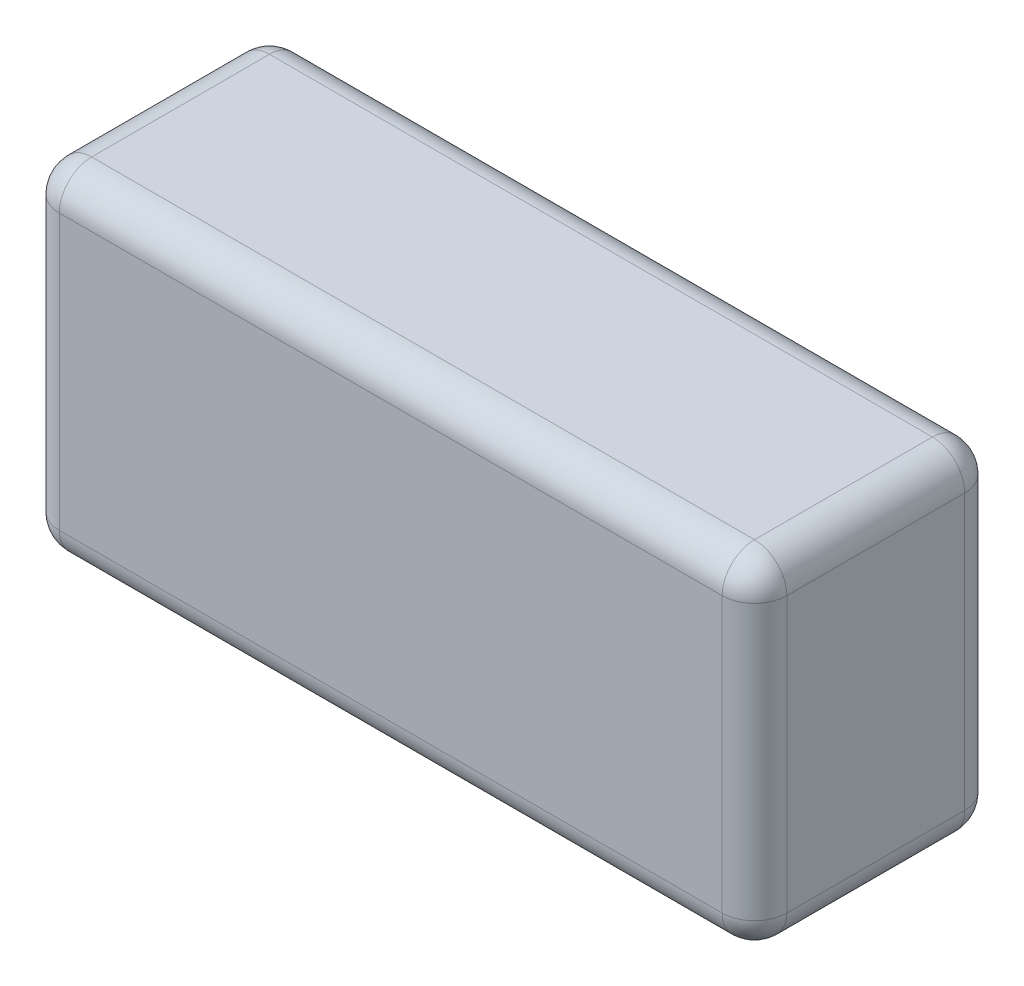
ISO-10303-21;
HEADER;
FILE_DESCRIPTION(('STEP AP214'),'2;1');
FILE_NAME('part.step','',(''),(''),'','','');
FILE_SCHEMA(('AUTOMOTIVE_DESIGN { 1 0 10303 214 1 1 1 1 }'));
ENDSEC;
DATA;
#1=APPLICATION_CONTEXT('core data for automotive mechanical design processes');
#2=APPLICATION_PROTOCOL_DEFINITION('international standard','automotive_design',2000,#1);
#3=PRODUCT_CONTEXT('',#1,'mechanical');
#4=PRODUCT('Part','Part','',(#3));
#5=PRODUCT_RELATED_PRODUCT_CATEGORY('part','',(#4));
#6=PRODUCT_DEFINITION_FORMATION('','',#4);
#7=PRODUCT_DEFINITION_CONTEXT('part definition',#1,'design');
#8=PRODUCT_DEFINITION('design','',#6,#7);
#9=PRODUCT_DEFINITION_SHAPE('','',#8);
#10=(LENGTH_UNIT() NAMED_UNIT(*) SI_UNIT(.MILLI.,.METRE.));
#11=(NAMED_UNIT(*) PLANE_ANGLE_UNIT() SI_UNIT($,.RADIAN.));
#12=(NAMED_UNIT(*) SI_UNIT($,.STERADIAN.) SOLID_ANGLE_UNIT());
#13=UNCERTAINTY_MEASURE_WITH_UNIT(LENGTH_MEASURE(1.E-05),#10,'distance_accuracy_value','');
#14=(GEOMETRIC_REPRESENTATION_CONTEXT(3) GLOBAL_UNCERTAINTY_ASSIGNED_CONTEXT((#13)) GLOBAL_UNIT_ASSIGNED_CONTEXT((#10,
#11,#12)) REPRESENTATION_CONTEXT('',''));
#15=CARTESIAN_POINT('',(0.,0.,0.));
#16=DIRECTION('',(0.,0.,1.));
#17=DIRECTION('',(1.,0.,0.));
#18=AXIS2_PLACEMENT_3D('',#15,#16,#17);
#19=CARTESIAN_POINT('',(37.5,35.,12.5));
#20=DIRECTION('',(-1.,0.,0.));
#21=DIRECTION('',(0.,0.,1.));
#22=AXIS2_PLACEMENT_3D('',#19,#20,#21);
#23=PLANE('',#22);
#24=DIRECTION('',(0.,-1.,0.));
#25=VECTOR('',#24,1.);
#26=CARTESIAN_POINT('',(37.5,35.,-9.16666666666667));
#27=LINE('',#26,#25);
#28=CARTESIAN_POINT('',(37.5,3.33333333333333,-9.16666666666667));
#29=VERTEX_POINT('',#28);
#30=CARTESIAN_POINT('',(37.5,31.6666666666667,-9.16666666666667));
#31=VERTEX_POINT('',#30);
#32=EDGE_CURVE('E140',#29,#31,#27,.F.);
#33=ORIENTED_EDGE('',*,*,#32,.T.);
#34=DIRECTION('',(0.,0.,-1.));
#35=VECTOR('',#34,1.);
#36=CARTESIAN_POINT('',(37.5,31.6666666666667,12.5));
#37=LINE('',#36,#35);
#38=CARTESIAN_POINT('',(37.5,31.6666666666667,9.16666666666667));
#39=VERTEX_POINT('',#38);
#40=EDGE_CURVE('E177',#31,#39,#37,.F.);
#41=ORIENTED_EDGE('',*,*,#40,.T.);
#42=DIRECTION('',(0.,-1.,0.));
#43=VECTOR('',#42,1.);
#44=CARTESIAN_POINT('',(37.5,35.,9.16666666666667));
#45=LINE('',#44,#43);
#46=CARTESIAN_POINT('',(37.5,3.33333333333333,9.16666666666667));
#47=VERTEX_POINT('',#46);
#48=EDGE_CURVE('E174',#39,#47,#45,.T.);
#49=ORIENTED_EDGE('',*,*,#48,.T.);
#50=DIRECTION('',(0.,0.,-1.));
#51=VECTOR('',#50,1.);
#52=CARTESIAN_POINT('',(37.5,3.33333333333333,-12.5));
#53=LINE('',#52,#51);
#54=EDGE_CURVE('E169',#47,#29,#53,.T.);
#55=ORIENTED_EDGE('',*,*,#54,.T.);
#56=EDGE_LOOP('',(#33,#41,#49,#55));
#57=FACE_BOUND('',#56,.T.);
#58=ADVANCED_FACE('F45',(#57),#23,.F.);
#59=CARTESIAN_POINT('',(-37.5,35.,-12.5));
#60=DIRECTION('',(0.,0.,1.));
#61=DIRECTION('',(1.,0.,0.));
#62=AXIS2_PLACEMENT_3D('',#59,#60,#61);
#63=PLANE('',#62);
#64=DIRECTION('',(0.,-1.,0.));
#65=VECTOR('',#64,1.);
#66=CARTESIAN_POINT('',(-34.1666666666667,35.,-12.5));
#67=LINE('',#66,#65);
#68=CARTESIAN_POINT('',(-34.1666666666667,3.33333333333333,-12.5));
#69=VERTEX_POINT('',#68);
#70=CARTESIAN_POINT('',(-34.1666666666667,31.6666666666667,-12.5));
#71=VERTEX_POINT('',#70);
#72=EDGE_CURVE('E162',#69,#71,#67,.F.);
#73=ORIENTED_EDGE('',*,*,#72,.T.);
#74=DIRECTION('',(-1.,0.,0.));
#75=VECTOR('',#74,1.);
#76=CARTESIAN_POINT('',(-37.5,31.6666666666667,-12.5));
#77=LINE('',#76,#75);
#78=CARTESIAN_POINT('',(34.1666666666667,31.6666666666667,-12.5));
#79=VERTEX_POINT('',#78);
#80=EDGE_CURVE('E166',#71,#79,#77,.F.);
#81=ORIENTED_EDGE('',*,*,#80,.T.);
#82=DIRECTION('',(0.,-1.,0.));
#83=VECTOR('',#82,1.);
#84=CARTESIAN_POINT('',(34.1666666666667,35.,-12.5));
#85=LINE('',#84,#83);
#86=CARTESIAN_POINT('',(34.1666666666667,3.33333333333333,-12.5));
#87=VERTEX_POINT('',#86);
#88=EDGE_CURVE('E138',#79,#87,#85,.T.);
#89=ORIENTED_EDGE('',*,*,#88,.T.);
#90=DIRECTION('',(-1.,0.,0.));
#91=VECTOR('',#90,1.);
#92=CARTESIAN_POINT('',(-37.5,3.33333333333333,-12.5));
#93=LINE('',#92,#91);
#94=EDGE_CURVE('E156',#87,#69,#93,.T.);
#95=ORIENTED_EDGE('',*,*,#94,.T.);
#96=EDGE_LOOP('',(#73,#81,#89,#95));
#97=FACE_BOUND('',#96,.T.);
#98=ADVANCED_FACE('F164',(#97),#63,.F.);
#99=CARTESIAN_POINT('',(-37.5,35.,12.5));
#100=DIRECTION('',(1.,0.,0.));
#101=DIRECTION('',(0.,0.,-1.));
#102=AXIS2_PLACEMENT_3D('',#99,#100,#101);
#103=PLANE('',#102);
#104=DIRECTION('',(0.,-1.,0.));
#105=VECTOR('',#104,1.);
#106=CARTESIAN_POINT('',(-37.5,35.,9.16666666666667));
#107=LINE('',#106,#105);
#108=CARTESIAN_POINT('',(-37.5,3.33333333333333,9.16666666666667));
#109=VERTEX_POINT('',#108);
#110=CARTESIAN_POINT('',(-37.5,31.6666666666667,9.16666666666667));
#111=VERTEX_POINT('',#110);
#112=EDGE_CURVE('E181',#109,#111,#107,.F.);
#113=ORIENTED_EDGE('',*,*,#112,.T.);
#114=DIRECTION('',(0.,0.,1.));
#115=VECTOR('',#114,1.);
#116=CARTESIAN_POINT('',(-37.5,31.6666666666667,12.5));
#117=LINE('',#116,#115);
#118=CARTESIAN_POINT('',(-37.5,31.6666666666667,-9.16666666666667));
#119=VERTEX_POINT('',#118);
#120=EDGE_CURVE('E186',#111,#119,#117,.F.);
#121=ORIENTED_EDGE('',*,*,#120,.T.);
#122=DIRECTION('',(0.,-1.,0.));
#123=VECTOR('',#122,1.);
#124=CARTESIAN_POINT('',(-37.5,35.,-9.16666666666667));
#125=LINE('',#124,#123);
#126=CARTESIAN_POINT('',(-37.5,3.33333333333333,-9.16666666666667));
#127=VERTEX_POINT('',#126);
#128=EDGE_CURVE('E183',#119,#127,#125,.T.);
#129=ORIENTED_EDGE('',*,*,#128,.T.);
#130=DIRECTION('',(0.,0.,1.));
#131=VECTOR('',#130,1.);
#132=CARTESIAN_POINT('',(-37.5,3.33333333333333,12.5));
#133=LINE('',#132,#131);
#134=EDGE_CURVE('E179',#127,#109,#133,.T.);
#135=ORIENTED_EDGE('',*,*,#134,.T.);
#136=EDGE_LOOP('',(#113,#121,#129,#135));
#137=FACE_BOUND('',#136,.T.);
#138=ADVANCED_FACE('F291',(#137),#103,.F.);
#139=CARTESIAN_POINT('',(-37.5,35.,12.5));
#140=DIRECTION('',(0.,0.,-1.));
#141=DIRECTION('',(-1.,0.,0.));
#142=AXIS2_PLACEMENT_3D('',#139,#140,#141);
#143=PLANE('',#142);
#144=DIRECTION('',(0.,-1.,0.));
#145=VECTOR('',#144,1.);
#146=CARTESIAN_POINT('',(34.1666666666667,35.,12.5));
#147=LINE('',#146,#145);
#148=CARTESIAN_POINT('',(34.1666666666667,3.33333333333333,12.5));
#149=VERTEX_POINT('',#148);
#150=CARTESIAN_POINT('',(34.1666666666667,31.6666666666667,12.5));
#151=VERTEX_POINT('',#150);
#152=EDGE_CURVE('E190',#149,#151,#147,.F.);
#153=ORIENTED_EDGE('',*,*,#152,.T.);
#154=DIRECTION('',(1.,0.,0.));
#155=VECTOR('',#154,1.);
#156=CARTESIAN_POINT('',(-37.5,31.6666666666667,12.5));
#157=LINE('',#156,#155);
#158=CARTESIAN_POINT('',(-34.1666666666667,31.6666666666667,12.5));
#159=VERTEX_POINT('',#158);
#160=EDGE_CURVE('E195',#151,#159,#157,.F.);
#161=ORIENTED_EDGE('',*,*,#160,.T.);
#162=DIRECTION('',(0.,-1.,0.));
#163=VECTOR('',#162,1.);
#164=CARTESIAN_POINT('',(-34.1666666666667,35.,12.5));
#165=LINE('',#164,#163);
#166=CARTESIAN_POINT('',(-34.1666666666667,3.33333333333333,12.5));
#167=VERTEX_POINT('',#166);
#168=EDGE_CURVE('E192',#159,#167,#165,.T.);
#169=ORIENTED_EDGE('',*,*,#168,.T.);
#170=DIRECTION('',(1.,0.,0.));
#171=VECTOR('',#170,1.);
#172=CARTESIAN_POINT('',(37.5,3.33333333333333,12.5));
#173=LINE('',#172,#171);
#174=EDGE_CURVE('E188',#167,#149,#173,.T.);
#175=ORIENTED_EDGE('',*,*,#174,.T.);
#176=EDGE_LOOP('',(#153,#161,#169,#175));
#177=FACE_BOUND('',#176,.T.);
#178=ADVANCED_FACE('F301',(#177),#143,.F.);
#179=CARTESIAN_POINT('',(0.,35.,0.));
#180=DIRECTION('',(0.,-1.,0.));
#181=DIRECTION('',(0.,0.,-1.));
#182=AXIS2_PLACEMENT_3D('',#179,#180,#181);
#183=PLANE('',#182);
#184=DIRECTION('',(0.,0.,1.));
#185=VECTOR('',#184,1.);
#186=CARTESIAN_POINT('',(-34.1666666666667,35.,0.));
#187=LINE('',#186,#185);
#188=CARTESIAN_POINT('',(-34.1666666666667,35.,-9.16666666666667));
#189=VERTEX_POINT('',#188);
#190=CARTESIAN_POINT('',(-34.1666666666667,35.,9.16666666666667));
#191=VERTEX_POINT('',#190);
#192=EDGE_CURVE('E201',#189,#191,#187,.T.);
#193=ORIENTED_EDGE('',*,*,#192,.T.);
#194=DIRECTION('',(1.,0.,0.));
#195=VECTOR('',#194,1.);
#196=CARTESIAN_POINT('',(0.,35.,9.16666666666667));
#197=LINE('',#196,#195);
#198=CARTESIAN_POINT('',(34.1666666666667,35.,9.16666666666667));
#199=VERTEX_POINT('',#198);
#200=EDGE_CURVE('E203',#191,#199,#197,.T.);
#201=ORIENTED_EDGE('',*,*,#200,.T.);
#202=DIRECTION('',(0.,0.,-1.));
#203=VECTOR('',#202,1.);
#204=CARTESIAN_POINT('',(34.1666666666667,35.,0.));
#205=LINE('',#204,#203);
#206=CARTESIAN_POINT('',(34.1666666666667,35.,-9.16666666666667));
#207=VERTEX_POINT('',#206);
#208=EDGE_CURVE('E197',#199,#207,#205,.T.);
#209=ORIENTED_EDGE('',*,*,#208,.T.);
#210=DIRECTION('',(-1.,0.,0.));
#211=VECTOR('',#210,1.);
#212=CARTESIAN_POINT('',(0.,35.,-9.16666666666667));
#213=LINE('',#212,#211);
#214=EDGE_CURVE('E199',#207,#189,#213,.T.);
#215=ORIENTED_EDGE('',*,*,#214,.T.);
#216=EDGE_LOOP('',(#193,#201,#209,#215));
#217=FACE_BOUND('',#216,.T.);
#218=ADVANCED_FACE('F283',(#217),#183,.F.);
#219=CARTESIAN_POINT('',(0.,0.,0.));
#220=DIRECTION('',(0.,-1.,0.));
#221=DIRECTION('',(0.,0.,-1.));
#222=AXIS2_PLACEMENT_3D('',#219,#220,#221);
#223=PLANE('',#222);
#224=DIRECTION('',(0.,0.,-1.));
#225=VECTOR('',#224,1.);
#226=CARTESIAN_POINT('',(34.1666666666667,0.,12.5));
#227=LINE('',#226,#225);
#228=CARTESIAN_POINT('',(34.1666666666667,0.,-9.16666666666667));
#229=VERTEX_POINT('',#228);
#230=CARTESIAN_POINT('',(34.1666666666667,0.,9.16666666666667));
#231=VERTEX_POINT('',#230);
#232=EDGE_CURVE('E206',#229,#231,#227,.F.);
#233=ORIENTED_EDGE('',*,*,#232,.T.);
#234=DIRECTION('',(1.,0.,0.));
#235=VECTOR('',#234,1.);
#236=CARTESIAN_POINT('',(-37.5,0.,9.16666666666667));
#237=LINE('',#236,#235);
#238=CARTESIAN_POINT('',(-34.1666666666667,0.,9.16666666666667));
#239=VERTEX_POINT('',#238);
#240=EDGE_CURVE('E11',#231,#239,#237,.F.);
#241=ORIENTED_EDGE('',*,*,#240,.T.);
#242=DIRECTION('',(0.,0.,1.));
#243=VECTOR('',#242,1.);
#244=CARTESIAN_POINT('',(-34.1666666666667,0.,-12.5));
#245=LINE('',#244,#243);
#246=CARTESIAN_POINT('',(-34.1666666666667,0.,-9.16666666666667));
#247=VERTEX_POINT('',#246);
#248=EDGE_CURVE('E54',#239,#247,#245,.F.);
#249=ORIENTED_EDGE('',*,*,#248,.T.);
#250=DIRECTION('',(-1.,0.,0.));
#251=VECTOR('',#250,1.);
#252=CARTESIAN_POINT('',(37.5,0.,-9.16666666666667));
#253=LINE('',#252,#251);
#254=EDGE_CURVE('E208',#247,#229,#253,.F.);
#255=ORIENTED_EDGE('',*,*,#254,.T.);
#256=EDGE_LOOP('',(#233,#241,#249,#255));
#257=FACE_BOUND('',#256,.T.);
#258=ADVANCED_FACE('F489',(#257),#223,.T.);
#259=CARTESIAN_POINT('',(-34.1666666666667,35.,9.16666666666667));
#260=DIRECTION('',(0.,-1.,0.));
#261=DIRECTION('',(0.,0.,-1.));
#262=AXIS2_PLACEMENT_3D('',#259,#260,#261);
#263=CYLINDRICAL_SURFACE('',#262,3.33333333333333);
#264=CARTESIAN_POINT('',(-34.1666666666667,31.6666666666667,9.16666666666667));
#265=DIRECTION('',(0.,1.,0.));
#266=DIRECTION('',(0.,0.,1.));
#267=AXIS2_PLACEMENT_3D('',#264,#265,#266);
#268=CIRCLE('',#267,3.33333333333333);
#269=EDGE_CURVE('E49',#111,#159,#268,.T.);
#270=ORIENTED_EDGE('',*,*,#269,.F.);
#271=ORIENTED_EDGE('',*,*,#112,.F.);
#272=CARTESIAN_POINT('',(-34.1666666666667,3.33333333333333,9.16666666666667));
#273=DIRECTION('',(0.,-1.,0.));
#274=DIRECTION('',(0.,0.,-1.));
#275=AXIS2_PLACEMENT_3D('',#272,#273,#274);
#276=CIRCLE('',#275,3.33333333333333);
#277=EDGE_CURVE('E261',#167,#109,#276,.T.);
#278=ORIENTED_EDGE('',*,*,#277,.F.);
#279=ORIENTED_EDGE('',*,*,#168,.F.);
#280=EDGE_LOOP('',(#270,#271,#278,#279));
#281=FACE_BOUND('',#280,.T.);
#282=ADVANCED_FACE('F47',(#281),#263,.T.);
#283=CARTESIAN_POINT('',(-34.1666666666667,31.6666666666667,9.16666666666667));
#284=DIRECTION('',(0.,0.,1.));
#285=DIRECTION('',(1.,0.,0.));
#286=AXIS2_PLACEMENT_3D('',#283,#284,#285);
#287=SPHERICAL_SURFACE('',#286,3.33333333333333);
#288=CARTESIAN_POINT('',(-34.1666666666667,31.6666666666667,9.16666666666667));
#289=DIRECTION('',(0.,0.,1.));
#290=DIRECTION('',(1.,0.,0.));
#291=AXIS2_PLACEMENT_3D('',#288,#289,#290);
#292=CIRCLE('',#291,3.33333333333333);
#293=EDGE_CURVE('E256',#111,#191,#292,.F.);
#294=ORIENTED_EDGE('',*,*,#293,.F.);
#295=ORIENTED_EDGE('',*,*,#269,.T.);
#296=CARTESIAN_POINT('',(-34.1666666666667,31.6666666666667,9.16666666666667));
#297=DIRECTION('',(-1.,0.,0.));
#298=DIRECTION('',(0.,0.,1.));
#299=AXIS2_PLACEMENT_3D('',#296,#297,#298);
#300=CIRCLE('',#299,3.33333333333333);
#301=EDGE_CURVE('E259',#191,#159,#300,.F.);
#302=ORIENTED_EDGE('',*,*,#301,.F.);
#303=EDGE_LOOP('',(#294,#295,#302));
#304=FACE_BOUND('',#303,.T.);
#305=ADVANCED_FACE('F271',(#304),#287,.T.);
#306=CARTESIAN_POINT('',(-34.1666666666667,3.33333333333333,9.16666666666667));
#307=DIRECTION('',(-1.,0.,0.));
#308=DIRECTION('',(0.,-1.,0.));
#309=AXIS2_PLACEMENT_3D('',#306,#307,#308);
#310=SPHERICAL_SURFACE('',#309,3.33333333333333);
#311=CARTESIAN_POINT('',(-34.1666666666667,3.33333333333333,9.16666666666667));
#312=DIRECTION('',(-1.,0.,0.));
#313=DIRECTION('',(0.,0.,1.));
#314=AXIS2_PLACEMENT_3D('',#311,#312,#313);
#315=CIRCLE('',#314,3.33333333333333);
#316=EDGE_CURVE('E251',#167,#239,#315,.F.);
#317=ORIENTED_EDGE('',*,*,#316,.F.);
#318=ORIENTED_EDGE('',*,*,#277,.T.);
#319=CARTESIAN_POINT('',(-34.1666666666667,3.33333333333333,9.16666666666667));
#320=DIRECTION('',(0.,0.,1.));
#321=DIRECTION('',(1.,0.,0.));
#322=AXIS2_PLACEMENT_3D('',#319,#320,#321);
#323=CIRCLE('',#322,3.33333333333333);
#324=EDGE_CURVE('E254',#239,#109,#323,.F.);
#325=ORIENTED_EDGE('',*,*,#324,.F.);
#326=EDGE_LOOP('',(#317,#318,#325));
#327=FACE_BOUND('',#326,.T.);
#328=ADVANCED_FACE('F468',(#327),#310,.T.);
#329=CARTESIAN_POINT('',(0.,31.6666666666667,9.16666666666667));
#330=DIRECTION('',(1.,0.,0.));
#331=DIRECTION('',(0.,0.,-1.));
#332=AXIS2_PLACEMENT_3D('',#329,#330,#331);
#333=CYLINDRICAL_SURFACE('',#332,3.33333333333333);
#334=ORIENTED_EDGE('',*,*,#301,.T.);
#335=ORIENTED_EDGE('',*,*,#160,.F.);
#336=CARTESIAN_POINT('',(34.1666666666667,31.6666666666667,9.16666666666667));
#337=DIRECTION('',(1.,0.,0.));
#338=DIRECTION('',(0.,0.,-1.));
#339=AXIS2_PLACEMENT_3D('',#336,#337,#338);
#340=CIRCLE('',#339,3.33333333333333);
#341=EDGE_CURVE('E245',#199,#151,#340,.T.);
#342=ORIENTED_EDGE('',*,*,#341,.F.);
#343=ORIENTED_EDGE('',*,*,#200,.F.);
#344=EDGE_LOOP('',(#334,#335,#342,#343));
#345=FACE_BOUND('',#344,.T.);
#346=ADVANCED_FACE('F279',(#345),#333,.T.);
#347=CARTESIAN_POINT('',(-34.1666666666667,31.6666666666667,0.));
#348=DIRECTION('',(0.,0.,1.));
#349=DIRECTION('',(1.,0.,0.));
#350=AXIS2_PLACEMENT_3D('',#347,#348,#349);
#351=CYLINDRICAL_SURFACE('',#350,3.33333333333333);
#352=ORIENTED_EDGE('',*,*,#293,.T.);
#353=ORIENTED_EDGE('',*,*,#192,.F.);
#354=CARTESIAN_POINT('',(-34.1666666666667,31.6666666666667,-9.16666666666667));
#355=DIRECTION('',(0.,0.,-1.));
#356=DIRECTION('',(-1.,0.,0.));
#357=AXIS2_PLACEMENT_3D('',#354,#355,#356);
#358=CIRCLE('',#357,3.33333333333333);
#359=EDGE_CURVE('E242',#119,#189,#358,.T.);
#360=ORIENTED_EDGE('',*,*,#359,.F.);
#361=ORIENTED_EDGE('',*,*,#120,.F.);
#362=EDGE_LOOP('',(#352,#353,#360,#361));
#363=FACE_BOUND('',#362,.T.);
#364=ADVANCED_FACE('F288',(#363),#351,.T.);
#365=CARTESIAN_POINT('',(-34.1666666666667,35.,-9.16666666666667));
#366=DIRECTION('',(0.,-1.,0.));
#367=DIRECTION('',(0.,0.,-1.));
#368=AXIS2_PLACEMENT_3D('',#365,#366,#367);
#369=CYLINDRICAL_SURFACE('',#368,3.33333333333333);
#370=CARTESIAN_POINT('',(-34.1666666666667,3.33333333333333,-9.16666666666667));
#371=DIRECTION('',(0.,-1.,0.));
#372=DIRECTION('',(0.,0.,-1.));
#373=AXIS2_PLACEMENT_3D('',#370,#371,#372);
#374=CIRCLE('',#373,3.33333333333333);
#375=EDGE_CURVE('E236',#127,#69,#374,.T.);
#376=ORIENTED_EDGE('',*,*,#375,.F.);
#377=ORIENTED_EDGE('',*,*,#128,.F.);
#378=CARTESIAN_POINT('',(-34.1666666666667,31.6666666666667,-9.16666666666667));
#379=DIRECTION('',(0.,1.,0.));
#380=DIRECTION('',(0.,0.,1.));
#381=AXIS2_PLACEMENT_3D('',#378,#379,#380);
#382=CIRCLE('',#381,3.33333333333333);
#383=EDGE_CURVE('E239',#71,#119,#382,.T.);
#384=ORIENTED_EDGE('',*,*,#383,.F.);
#385=ORIENTED_EDGE('',*,*,#72,.F.);
#386=EDGE_LOOP('',(#376,#377,#384,#385));
#387=FACE_BOUND('',#386,.T.);
#388=ADVANCED_FACE('F295',(#387),#369,.T.);
#389=CARTESIAN_POINT('',(-34.1666666666667,3.33333333333333,12.5));
#390=DIRECTION('',(0.,0.,-1.));
#391=DIRECTION('',(-1.,0.,0.));
#392=AXIS2_PLACEMENT_3D('',#389,#390,#391);
#393=CYLINDRICAL_SURFACE('',#392,3.33333333333333);
#394=ORIENTED_EDGE('',*,*,#324,.T.);
#395=ORIENTED_EDGE('',*,*,#134,.F.);
#396=CARTESIAN_POINT('',(-34.1666666666667,3.33333333333333,-9.16666666666667));
#397=DIRECTION('',(0.,0.,-1.));
#398=DIRECTION('',(-1.,0.,0.));
#399=AXIS2_PLACEMENT_3D('',#396,#397,#398);
#400=CIRCLE('',#399,3.33333333333333);
#401=EDGE_CURVE('E234',#247,#127,#400,.T.);
#402=ORIENTED_EDGE('',*,*,#401,.F.);
#403=ORIENTED_EDGE('',*,*,#248,.F.);
#404=EDGE_LOOP('',(#394,#395,#402,#403));
#405=FACE_BOUND('',#404,.T.);
#406=ADVANCED_FACE('F299',(#405),#393,.T.);
#407=CARTESIAN_POINT('',(-37.5,3.33333333333333,9.16666666666667));
#408=DIRECTION('',(-1.,0.,0.));
#409=DIRECTION('',(0.,0.,1.));
#410=AXIS2_PLACEMENT_3D('',#407,#408,#409);
#411=CYLINDRICAL_SURFACE('',#410,3.33333333333333);
#412=ORIENTED_EDGE('',*,*,#316,.T.);
#413=ORIENTED_EDGE('',*,*,#240,.F.);
#414=CARTESIAN_POINT('',(34.1666666666667,3.33333333333333,9.16666666666667));
#415=DIRECTION('',(1.,0.,0.));
#416=DIRECTION('',(0.,0.,-1.));
#417=AXIS2_PLACEMENT_3D('',#414,#415,#416);
#418=CIRCLE('',#417,3.33333333333333);
#419=EDGE_CURVE('E231',#149,#231,#418,.T.);
#420=ORIENTED_EDGE('',*,*,#419,.F.);
#421=ORIENTED_EDGE('',*,*,#174,.F.);
#422=EDGE_LOOP('',(#412,#413,#420,#421));
#423=FACE_BOUND('',#422,.T.);
#424=ADVANCED_FACE('F311',(#423),#411,.T.);
#425=CARTESIAN_POINT('',(34.1666666666667,35.,9.16666666666667));
#426=DIRECTION('',(0.,-1.,0.));
#427=DIRECTION('',(0.,0.,-1.));
#428=AXIS2_PLACEMENT_3D('',#425,#426,#427);
#429=CYLINDRICAL_SURFACE('',#428,3.33333333333333);
#430=CARTESIAN_POINT('',(34.1666666666667,31.6666666666667,9.16666666666667));
#431=DIRECTION('',(0.,1.,0.));
#432=DIRECTION('',(0.,0.,1.));
#433=AXIS2_PLACEMENT_3D('',#430,#431,#432);
#434=CIRCLE('',#433,3.33333333333333);
#435=EDGE_CURVE('E248',#151,#39,#434,.T.);
#436=ORIENTED_EDGE('',*,*,#435,.F.);
#437=ORIENTED_EDGE('',*,*,#152,.F.);
#438=CARTESIAN_POINT('',(34.1666666666667,3.33333333333333,9.16666666666667));
#439=DIRECTION('',(0.,-1.,0.));
#440=DIRECTION('',(0.,0.,-1.));
#441=AXIS2_PLACEMENT_3D('',#438,#439,#440);
#442=CIRCLE('',#441,3.33333333333333);
#443=EDGE_CURVE('E228',#47,#149,#442,.T.);
#444=ORIENTED_EDGE('',*,*,#443,.F.);
#445=ORIENTED_EDGE('',*,*,#48,.F.);
#446=EDGE_LOOP('',(#436,#437,#444,#445));
#447=FACE_BOUND('',#446,.T.);
#448=ADVANCED_FACE('F306',(#447),#429,.T.);
#449=CARTESIAN_POINT('',(34.1666666666667,31.6666666666667,9.16666666666667));
#450=DIRECTION('',(0.,0.,1.));
#451=DIRECTION('',(1.,0.,0.));
#452=AXIS2_PLACEMENT_3D('',#449,#450,#451);
#453=SPHERICAL_SURFACE('',#452,3.33333333333333);
#454=ORIENTED_EDGE('',*,*,#341,.T.);
#455=ORIENTED_EDGE('',*,*,#435,.T.);
#456=CARTESIAN_POINT('',(34.1666666666667,31.6666666666667,9.16666666666667));
#457=DIRECTION('',(0.,0.,1.));
#458=DIRECTION('',(1.,0.,0.));
#459=AXIS2_PLACEMENT_3D('',#456,#457,#458);
#460=CIRCLE('',#459,3.33333333333333);
#461=EDGE_CURVE('E225',#199,#39,#460,.F.);
#462=ORIENTED_EDGE('',*,*,#461,.F.);
#463=EDGE_LOOP('',(#454,#455,#462));
#464=FACE_BOUND('',#463,.T.);
#465=ADVANCED_FACE('F322',(#464),#453,.T.);
#466=CARTESIAN_POINT('',(-34.1666666666667,31.6666666666667,-9.16666666666667));
#467=DIRECTION('',(-1.,0.,0.));
#468=DIRECTION('',(0.,0.,1.));
#469=AXIS2_PLACEMENT_3D('',#466,#467,#468);
#470=SPHERICAL_SURFACE('',#469,3.33333333333333);
#471=ORIENTED_EDGE('',*,*,#383,.T.);
#472=ORIENTED_EDGE('',*,*,#359,.T.);
#473=CARTESIAN_POINT('',(-34.1666666666667,31.6666666666667,-9.16666666666667));
#474=DIRECTION('',(-1.,0.,0.));
#475=DIRECTION('',(0.,0.,1.));
#476=AXIS2_PLACEMENT_3D('',#473,#474,#475);
#477=CIRCLE('',#476,3.33333333333333);
#478=EDGE_CURVE('E222',#71,#189,#477,.F.);
#479=ORIENTED_EDGE('',*,*,#478,.F.);
#480=EDGE_LOOP('',(#471,#472,#479));
#481=FACE_BOUND('',#480,.T.);
#482=ADVANCED_FACE('F332',(#481),#470,.T.);
#483=CARTESIAN_POINT('',(-34.1666666666667,3.33333333333333,-9.16666666666667));
#484=DIRECTION('',(-1.,0.,0.));
#485=DIRECTION('',(0.,-1.,0.));
#486=AXIS2_PLACEMENT_3D('',#483,#484,#485);
#487=SPHERICAL_SURFACE('',#486,3.33333333333333);
#488=ORIENTED_EDGE('',*,*,#401,.T.);
#489=ORIENTED_EDGE('',*,*,#375,.T.);
#490=CARTESIAN_POINT('',(-34.1666666666667,3.33333333333333,-9.16666666666667));
#491=DIRECTION('',(-1.,0.,0.));
#492=DIRECTION('',(0.,0.,1.));
#493=AXIS2_PLACEMENT_3D('',#490,#491,#492);
#494=CIRCLE('',#493,3.33333333333333);
#495=EDGE_CURVE('E159',#247,#69,#494,.F.);
#496=ORIENTED_EDGE('',*,*,#495,.F.);
#497=EDGE_LOOP('',(#488,#489,#496));
#498=FACE_BOUND('',#497,.T.);
#499=ADVANCED_FACE('F334',(#498),#487,.T.);
#500=CARTESIAN_POINT('',(34.1666666666667,3.33333333333333,9.16666666666667));
#501=DIRECTION('',(0.,0.,1.));
#502=DIRECTION('',(0.,-1.,0.));
#503=AXIS2_PLACEMENT_3D('',#500,#501,#502);
#504=SPHERICAL_SURFACE('',#503,3.33333333333333);
#505=ORIENTED_EDGE('',*,*,#443,.T.);
#506=ORIENTED_EDGE('',*,*,#419,.T.);
#507=CARTESIAN_POINT('',(34.1666666666667,3.33333333333333,9.16666666666667));
#508=DIRECTION('',(0.,0.,1.));
#509=DIRECTION('',(1.,0.,0.));
#510=AXIS2_PLACEMENT_3D('',#507,#508,#509);
#511=CIRCLE('',#510,3.33333333333333);
#512=EDGE_CURVE('E218',#47,#231,#511,.F.);
#513=ORIENTED_EDGE('',*,*,#512,.F.);
#514=EDGE_LOOP('',(#505,#506,#513));
#515=FACE_BOUND('',#514,.T.);
#516=ADVANCED_FACE('F313',(#515),#504,.T.);
#517=CARTESIAN_POINT('',(34.1666666666667,31.6666666666667,0.));
#518=DIRECTION('',(0.,0.,-1.));
#519=DIRECTION('',(-1.,0.,0.));
#520=AXIS2_PLACEMENT_3D('',#517,#518,#519);
#521=CYLINDRICAL_SURFACE('',#520,3.33333333333333);
#522=ORIENTED_EDGE('',*,*,#461,.T.);
#523=ORIENTED_EDGE('',*,*,#40,.F.);
#524=CARTESIAN_POINT('',(34.1666666666667,31.6666666666667,-9.16666666666667));
#525=DIRECTION('',(0.,0.,-1.));
#526=DIRECTION('',(-1.,0.,0.));
#527=AXIS2_PLACEMENT_3D('',#524,#525,#526);
#528=CIRCLE('',#527,3.33333333333333);
#529=EDGE_CURVE('E215',#207,#31,#528,.T.);
#530=ORIENTED_EDGE('',*,*,#529,.F.);
#531=ORIENTED_EDGE('',*,*,#208,.F.);
#532=EDGE_LOOP('',(#522,#523,#530,#531));
#533=FACE_BOUND('',#532,.T.);
#534=ADVANCED_FACE('F324',(#533),#521,.T.);
#535=CARTESIAN_POINT('',(0.,31.6666666666667,-9.16666666666667));
#536=DIRECTION('',(-1.,0.,0.));
#537=DIRECTION('',(0.,0.,1.));
#538=AXIS2_PLACEMENT_3D('',#535,#536,#537);
#539=CYLINDRICAL_SURFACE('',#538,3.33333333333333);
#540=ORIENTED_EDGE('',*,*,#478,.T.);
#541=ORIENTED_EDGE('',*,*,#214,.F.);
#542=CARTESIAN_POINT('',(34.1666666666667,31.6666666666667,-9.16666666666667));
#543=DIRECTION('',(1.,0.,0.));
#544=DIRECTION('',(0.,1.,0.));
#545=AXIS2_PLACEMENT_3D('',#542,#543,#544);
#546=CIRCLE('',#545,3.33333333333333);
#547=EDGE_CURVE('E153',#79,#207,#546,.T.);
#548=ORIENTED_EDGE('',*,*,#547,.F.);
#549=ORIENTED_EDGE('',*,*,#80,.F.);
#550=EDGE_LOOP('',(#540,#541,#548,#549));
#551=FACE_BOUND('',#550,.T.);
#552=ADVANCED_FACE('F330',(#551),#539,.T.);
#553=CARTESIAN_POINT('',(-37.5,3.33333333333333,-9.16666666666667));
#554=DIRECTION('',(1.,0.,0.));
#555=DIRECTION('',(0.,0.,-1.));
#556=AXIS2_PLACEMENT_3D('',#553,#554,#555);
#557=CYLINDRICAL_SURFACE('',#556,3.33333333333333);
#558=ORIENTED_EDGE('',*,*,#495,.T.);
#559=ORIENTED_EDGE('',*,*,#94,.F.);
#560=CARTESIAN_POINT('',(34.1666666666667,3.33333333333333,-9.16666666666667));
#561=DIRECTION('',(1.,0.,0.));
#562=DIRECTION('',(0.,0.,-1.));
#563=AXIS2_PLACEMENT_3D('',#560,#561,#562);
#564=CIRCLE('',#563,3.33333333333333);
#565=EDGE_CURVE('E146',#229,#87,#564,.T.);
#566=ORIENTED_EDGE('',*,*,#565,.F.);
#567=ORIENTED_EDGE('',*,*,#254,.F.);
#568=EDGE_LOOP('',(#558,#559,#566,#567));
#569=FACE_BOUND('',#568,.T.);
#570=ADVANCED_FACE('F157',(#569),#557,.T.);
#571=CARTESIAN_POINT('',(34.1666666666667,3.33333333333333,12.5));
#572=DIRECTION('',(0.,0.,1.));
#573=DIRECTION('',(1.,0.,0.));
#574=AXIS2_PLACEMENT_3D('',#571,#572,#573);
#575=CYLINDRICAL_SURFACE('',#574,3.33333333333333);
#576=ORIENTED_EDGE('',*,*,#512,.T.);
#577=ORIENTED_EDGE('',*,*,#232,.F.);
#578=CARTESIAN_POINT('',(34.1666666666667,3.33333333333333,-9.16666666666667));
#579=DIRECTION('',(0.,0.,-1.));
#580=DIRECTION('',(-1.,0.,0.));
#581=AXIS2_PLACEMENT_3D('',#578,#579,#580);
#582=CIRCLE('',#581,3.33333333333333);
#583=EDGE_CURVE('E150',#29,#229,#582,.T.);
#584=ORIENTED_EDGE('',*,*,#583,.F.);
#585=ORIENTED_EDGE('',*,*,#54,.F.);
#586=EDGE_LOOP('',(#576,#577,#584,#585));
#587=FACE_BOUND('',#586,.T.);
#588=ADVANCED_FACE('F317',(#587),#575,.T.);
#589=CARTESIAN_POINT('',(34.1666666666667,31.6666666666667,-9.16666666666667));
#590=DIRECTION('',(0.,1.,0.));
#591=DIRECTION('',(0.,0.,1.));
#592=AXIS2_PLACEMENT_3D('',#589,#590,#591);
#593=SPHERICAL_SURFACE('',#592,3.33333333333333);
#594=ORIENTED_EDGE('',*,*,#547,.T.);
#595=ORIENTED_EDGE('',*,*,#529,.T.);
#596=CARTESIAN_POINT('',(34.1666666666667,31.6666666666667,-9.16666666666667));
#597=DIRECTION('',(0.,1.,0.));
#598=DIRECTION('',(0.,0.,1.));
#599=AXIS2_PLACEMENT_3D('',#596,#597,#598);
#600=CIRCLE('',#599,3.33333333333333);
#601=EDGE_CURVE('E143',#79,#31,#600,.F.);
#602=ORIENTED_EDGE('',*,*,#601,.F.);
#603=EDGE_LOOP('',(#594,#595,#602));
#604=FACE_BOUND('',#603,.T.);
#605=ADVANCED_FACE('F328',(#604),#593,.T.);
#606=CARTESIAN_POINT('',(34.1666666666667,3.33333333333333,-9.16666666666667));
#607=DIRECTION('',(0.,-1.,0.));
#608=DIRECTION('',(0.,0.,-1.));
#609=AXIS2_PLACEMENT_3D('',#606,#607,#608);
#610=SPHERICAL_SURFACE('',#609,3.33333333333333);
#611=ORIENTED_EDGE('',*,*,#583,.T.);
#612=ORIENTED_EDGE('',*,*,#565,.T.);
#613=CARTESIAN_POINT('',(34.1666666666667,3.33333333333333,-9.16666666666667));
#614=DIRECTION('',(0.,-1.,0.));
#615=DIRECTION('',(0.,0.,-1.));
#616=AXIS2_PLACEMENT_3D('',#613,#614,#615);
#617=CIRCLE('',#616,3.33333333333333);
#618=EDGE_CURVE('E134',#29,#87,#617,.F.);
#619=ORIENTED_EDGE('',*,*,#618,.F.);
#620=EDGE_LOOP('',(#611,#612,#619));
#621=FACE_BOUND('',#620,.T.);
#622=ADVANCED_FACE('F148',(#621),#610,.T.);
#623=CARTESIAN_POINT('',(34.1666666666667,35.,-9.16666666666667));
#624=DIRECTION('',(0.,-1.,0.));
#625=DIRECTION('',(0.,0.,-1.));
#626=AXIS2_PLACEMENT_3D('',#623,#624,#625);
#627=CYLINDRICAL_SURFACE('',#626,3.33333333333333);
#628=ORIENTED_EDGE('',*,*,#601,.T.);
#629=ORIENTED_EDGE('',*,*,#32,.F.);
#630=ORIENTED_EDGE('',*,*,#618,.T.);
#631=ORIENTED_EDGE('',*,*,#88,.F.);
#632=EDGE_LOOP('',(#628,#629,#630,#631));
#633=FACE_BOUND('',#632,.T.);
#634=ADVANCED_FACE('F136',(#633),#627,.T.);
#635=CLOSED_SHELL('',(#58,#98,#138,#178,#218,#258,#282,#305,#328,#346,#364,#388,#406,#424,#448,
#465,#482,#499,#516,#534,#552,#570,#588,#605,#622,#634));
#636=MANIFOLD_SOLID_BREP('B2',#635);
#637=ADVANCED_BREP_SHAPE_REPRESENTATION('',(#18,#636),#14);
#638=SHAPE_DEFINITION_REPRESENTATION(#9,#637);
ENDSEC;
END-ISO-10303-21;
